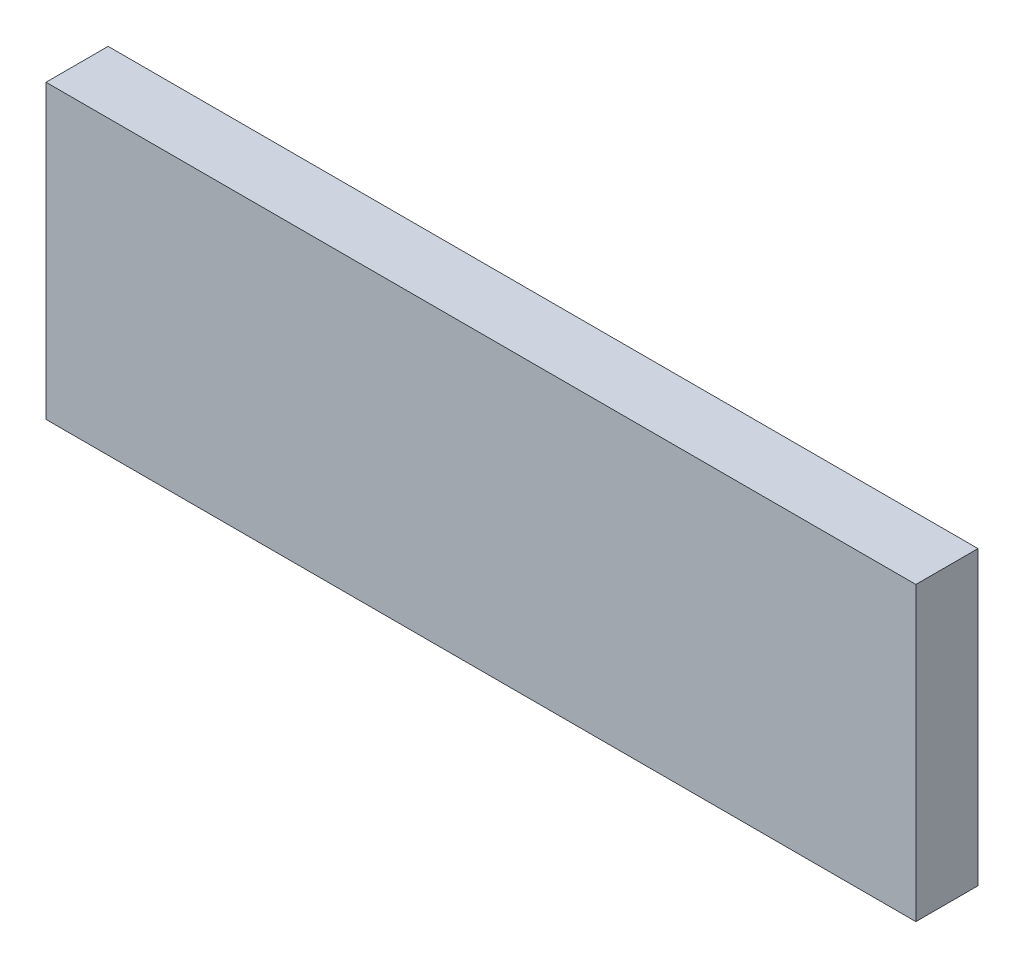
ISO-10303-21;
HEADER;
FILE_DESCRIPTION(('STEP AP214'),'2;1');
FILE_NAME('part.step','',(''),(''),'','','');
FILE_SCHEMA(('AUTOMOTIVE_DESIGN { 1 0 10303 214 1 1 1 1 }'));
ENDSEC;
DATA;
#1=APPLICATION_CONTEXT('core data for automotive mechanical design processes');
#2=APPLICATION_PROTOCOL_DEFINITION('international standard','automotive_design',2000,#1);
#3=PRODUCT_CONTEXT('',#1,'mechanical');
#4=PRODUCT('Part','Part','',(#3));
#5=PRODUCT_RELATED_PRODUCT_CATEGORY('part','',(#4));
#6=PRODUCT_DEFINITION_FORMATION('','',#4);
#7=PRODUCT_DEFINITION_CONTEXT('part definition',#1,'design');
#8=PRODUCT_DEFINITION('design','',#6,#7);
#9=PRODUCT_DEFINITION_SHAPE('','',#8);
#10=(LENGTH_UNIT() NAMED_UNIT(*) SI_UNIT(.MILLI.,.METRE.));
#11=(NAMED_UNIT(*) PLANE_ANGLE_UNIT() SI_UNIT($,.RADIAN.));
#12=(NAMED_UNIT(*) SI_UNIT($,.STERADIAN.) SOLID_ANGLE_UNIT());
#13=UNCERTAINTY_MEASURE_WITH_UNIT(LENGTH_MEASURE(1.E-05),#10,'distance_accuracy_value','');
#14=(GEOMETRIC_REPRESENTATION_CONTEXT(3) GLOBAL_UNCERTAINTY_ASSIGNED_CONTEXT((#13)) GLOBAL_UNIT_ASSIGNED_CONTEXT((#10,
#11,#12)) REPRESENTATION_CONTEXT('',''));
#15=CARTESIAN_POINT('',(0.,0.,0.));
#16=DIRECTION('',(0.,0.,1.));
#17=DIRECTION('',(1.,0.,0.));
#18=AXIS2_PLACEMENT_3D('',#15,#16,#17);
#19=CARTESIAN_POINT('',(0.,-23.35,3.));
#20=DIRECTION('',(0.,0.,1.));
#21=DIRECTION('',(1.,0.,0.));
#22=AXIS2_PLACEMENT_3D('',#19,#20,#21);
#23=PLANE('',#22);
#24=DIRECTION('',(-1.,0.,0.));
#25=VECTOR('',#24,1.);
#26=CARTESIAN_POINT('',(7.,-25.7,3.));
#27=LINE('',#26,#25);
#28=CARTESIAN_POINT('',(7.,-25.7,3.));
#29=VERTEX_POINT('',#28);
#30=CARTESIAN_POINT('',(-7.,-25.7,3.));
#31=VERTEX_POINT('',#30);
#32=EDGE_CURVE('E21',#29,#31,#27,.T.);
#33=ORIENTED_EDGE('',*,*,#32,.T.);
#34=DIRECTION('',(0.,1.,0.));
#35=VECTOR('',#34,1.);
#36=CARTESIAN_POINT('',(-7.,-25.7,3.));
#37=LINE('',#36,#35);
#38=CARTESIAN_POINT('',(-7.,-21.,3.));
#39=VERTEX_POINT('',#38);
#40=EDGE_CURVE('E94',#31,#39,#37,.T.);
#41=ORIENTED_EDGE('',*,*,#40,.T.);
#42=DIRECTION('',(1.,0.,0.));
#43=VECTOR('',#42,1.);
#44=CARTESIAN_POINT('',(-7.,-21.,3.));
#45=LINE('',#44,#43);
#46=CARTESIAN_POINT('',(7.,-21.,3.));
#47=VERTEX_POINT('',#46);
#48=EDGE_CURVE('E64',#39,#47,#45,.T.);
#49=ORIENTED_EDGE('',*,*,#48,.T.);
#50=DIRECTION('',(0.,-1.,0.));
#51=VECTOR('',#50,1.);
#52=CARTESIAN_POINT('',(7.,-21.,3.));
#53=LINE('',#52,#51);
#54=EDGE_CURVE('E80',#47,#29,#53,.T.);
#55=ORIENTED_EDGE('',*,*,#54,.T.);
#56=EDGE_LOOP('',(#33,#41,#49,#55));
#57=FACE_BOUND('',#56,.T.);
#58=ADVANCED_FACE('F17',(#57),#23,.F.);
#59=CARTESIAN_POINT('',(0.,-23.35,4.));
#60=DIRECTION('',(0.,0.,1.));
#61=DIRECTION('',(1.,0.,0.));
#62=AXIS2_PLACEMENT_3D('',#59,#60,#61);
#63=PLANE('',#62);
#64=DIRECTION('',(1.,0.,0.));
#65=VECTOR('',#64,1.);
#66=CARTESIAN_POINT('',(7.,-25.7,4.));
#67=LINE('',#66,#65);
#68=CARTESIAN_POINT('',(-7.,-25.7,4.));
#69=VERTEX_POINT('',#68);
#70=CARTESIAN_POINT('',(7.,-25.7,4.));
#71=VERTEX_POINT('',#70);
#72=EDGE_CURVE('E11',#69,#71,#67,.T.);
#73=ORIENTED_EDGE('',*,*,#72,.T.);
#74=DIRECTION('',(0.,1.,0.));
#75=VECTOR('',#74,1.);
#76=CARTESIAN_POINT('',(7.,-21.,4.));
#77=LINE('',#76,#75);
#78=CARTESIAN_POINT('',(7.,-21.,4.));
#79=VERTEX_POINT('',#78);
#80=EDGE_CURVE('E71',#71,#79,#77,.T.);
#81=ORIENTED_EDGE('',*,*,#80,.T.);
#82=DIRECTION('',(-1.,0.,0.));
#83=VECTOR('',#82,1.);
#84=CARTESIAN_POINT('',(-7.,-21.,4.));
#85=LINE('',#84,#83);
#86=CARTESIAN_POINT('',(-7.,-21.,4.));
#87=VERTEX_POINT('',#86);
#88=EDGE_CURVE('E89',#79,#87,#85,.T.);
#89=ORIENTED_EDGE('',*,*,#88,.T.);
#90=DIRECTION('',(0.,-1.,0.));
#91=VECTOR('',#90,1.);
#92=CARTESIAN_POINT('',(-7.,-25.7,4.));
#93=LINE('',#92,#91);
#94=EDGE_CURVE('E104',#87,#69,#93,.T.);
#95=ORIENTED_EDGE('',*,*,#94,.T.);
#96=EDGE_LOOP('',(#73,#81,#89,#95));
#97=FACE_BOUND('',#96,.T.);
#98=ADVANCED_FACE('F166',(#97),#63,.T.);
#99=CARTESIAN_POINT('',(-7.,-25.7,3.));
#100=DIRECTION('',(0.,-1.,0.));
#101=DIRECTION('',(0.,0.,-1.));
#102=AXIS2_PLACEMENT_3D('',#99,#100,#101);
#103=PLANE('',#102);
#104=ORIENTED_EDGE('',*,*,#32,.F.);
#105=DIRECTION('',(0.,0.,1.));
#106=VECTOR('',#105,1.);
#107=CARTESIAN_POINT('',(7.,-25.7,3.));
#108=LINE('',#107,#106);
#109=EDGE_CURVE('E84',#29,#71,#108,.T.);
#110=ORIENTED_EDGE('',*,*,#109,.T.);
#111=ORIENTED_EDGE('',*,*,#72,.F.);
#112=DIRECTION('',(0.,0.,1.));
#113=VECTOR('',#112,1.);
#114=CARTESIAN_POINT('',(-7.,-25.7,3.));
#115=LINE('',#114,#113);
#116=EDGE_CURVE('E111',#31,#69,#115,.T.);
#117=ORIENTED_EDGE('',*,*,#116,.F.);
#118=EDGE_LOOP('',(#104,#110,#111,#117));
#119=FACE_BOUND('',#118,.T.);
#120=ADVANCED_FACE('F19',(#119),#103,.T.);
#121=CARTESIAN_POINT('',(7.,-25.7,3.));
#122=DIRECTION('',(1.,0.,0.));
#123=DIRECTION('',(0.,1.,0.));
#124=AXIS2_PLACEMENT_3D('',#121,#122,#123);
#125=PLANE('',#124);
#126=ORIENTED_EDGE('',*,*,#54,.F.);
#127=DIRECTION('',(0.,0.,1.));
#128=VECTOR('',#127,1.);
#129=CARTESIAN_POINT('',(7.,-21.,3.));
#130=LINE('',#129,#128);
#131=EDGE_CURVE('E82',#47,#79,#130,.T.);
#132=ORIENTED_EDGE('',*,*,#131,.T.);
#133=ORIENTED_EDGE('',*,*,#80,.F.);
#134=ORIENTED_EDGE('',*,*,#109,.F.);
#135=EDGE_LOOP('',(#126,#132,#133,#134));
#136=FACE_BOUND('',#135,.T.);
#137=ADVANCED_FACE('F81',(#136),#125,.T.);
#138=CARTESIAN_POINT('',(7.,-21.,3.));
#139=DIRECTION('',(0.,1.,0.));
#140=DIRECTION('',(1.,0.,0.));
#141=AXIS2_PLACEMENT_3D('',#138,#139,#140);
#142=PLANE('',#141);
#143=ORIENTED_EDGE('',*,*,#48,.F.);
#144=DIRECTION('',(0.,0.,1.));
#145=VECTOR('',#144,1.);
#146=CARTESIAN_POINT('',(-7.,-21.,3.));
#147=LINE('',#146,#145);
#148=EDGE_CURVE('E96',#39,#87,#147,.T.);
#149=ORIENTED_EDGE('',*,*,#148,.T.);
#150=ORIENTED_EDGE('',*,*,#88,.F.);
#151=ORIENTED_EDGE('',*,*,#131,.F.);
#152=EDGE_LOOP('',(#143,#149,#150,#151));
#153=FACE_BOUND('',#152,.T.);
#154=ADVANCED_FACE('F88',(#153),#142,.T.);
#155=CARTESIAN_POINT('',(-7.,-21.,3.));
#156=DIRECTION('',(-1.,0.,0.));
#157=DIRECTION('',(0.,0.,1.));
#158=AXIS2_PLACEMENT_3D('',#155,#156,#157);
#159=PLANE('',#158);
#160=ORIENTED_EDGE('',*,*,#40,.F.);
#161=ORIENTED_EDGE('',*,*,#116,.T.);
#162=ORIENTED_EDGE('',*,*,#94,.F.);
#163=ORIENTED_EDGE('',*,*,#148,.F.);
#164=EDGE_LOOP('',(#160,#161,#162,#163));
#165=FACE_BOUND('',#164,.T.);
#166=ADVANCED_FACE('F154',(#165),#159,.T.);
#167=CLOSED_SHELL('',(#58,#98,#120,#137,#154,#166));
#168=MANIFOLD_SOLID_BREP('B1',#167);
#169=ADVANCED_BREP_SHAPE_REPRESENTATION('',(#18,#168),#14);
#170=SHAPE_DEFINITION_REPRESENTATION(#9,#169);
ENDSEC;
END-ISO-10303-21;
